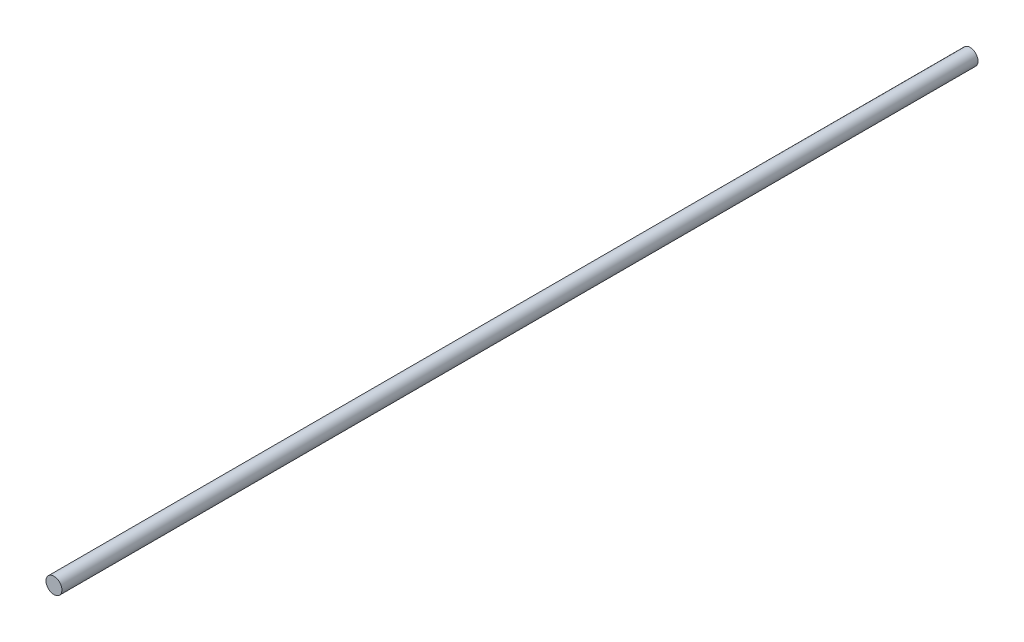
ISO-10303-21;
HEADER;
FILE_DESCRIPTION(('STEP AP214'),'2;1');
FILE_NAME('part.step','',(''),(''),'','','');
FILE_SCHEMA(('AUTOMOTIVE_DESIGN { 1 0 10303 214 1 1 1 1 }'));
ENDSEC;
DATA;
#1=APPLICATION_CONTEXT('core data for automotive mechanical design processes');
#2=APPLICATION_PROTOCOL_DEFINITION('international standard','automotive_design',2000,#1);
#3=PRODUCT_CONTEXT('',#1,'mechanical');
#4=PRODUCT('Part','Part','',(#3));
#5=PRODUCT_RELATED_PRODUCT_CATEGORY('part','',(#4));
#6=PRODUCT_DEFINITION_FORMATION('','',#4);
#7=PRODUCT_DEFINITION_CONTEXT('part definition',#1,'design');
#8=PRODUCT_DEFINITION('design','',#6,#7);
#9=PRODUCT_DEFINITION_SHAPE('','',#8);
#10=(LENGTH_UNIT() NAMED_UNIT(*) SI_UNIT(.MILLI.,.METRE.));
#11=(NAMED_UNIT(*) PLANE_ANGLE_UNIT() SI_UNIT($,.RADIAN.));
#12=(NAMED_UNIT(*) SI_UNIT($,.STERADIAN.) SOLID_ANGLE_UNIT());
#13=UNCERTAINTY_MEASURE_WITH_UNIT(LENGTH_MEASURE(1.E-05),#10,'distance_accuracy_value','');
#14=(GEOMETRIC_REPRESENTATION_CONTEXT(3) GLOBAL_UNCERTAINTY_ASSIGNED_CONTEXT((#13)) GLOBAL_UNIT_ASSIGNED_CONTEXT((#10,
#11,#12)) REPRESENTATION_CONTEXT('',''));
#15=CARTESIAN_POINT('',(0.,0.,0.));
#16=DIRECTION('',(0.,0.,1.));
#17=DIRECTION('',(1.,0.,0.));
#18=AXIS2_PLACEMENT_3D('',#15,#16,#17);
#19=CARTESIAN_POINT('',(0.,0.,460.));
#20=DIRECTION('',(0.,0.,-1.));
#21=DIRECTION('',(-1.,0.,0.));
#22=AXIS2_PLACEMENT_3D('',#19,#20,#21);
#23=CYLINDRICAL_SURFACE('',#22,4.);
#24=CARTESIAN_POINT('',(0.,0.,460.));
#25=DIRECTION('',(0.,0.,1.));
#26=DIRECTION('',(1.,0.,0.));
#27=AXIS2_PLACEMENT_3D('',#24,#25,#26);
#28=CIRCLE('',#27,4.);
#29=CARTESIAN_POINT('',(4.,0.,460.));
#30=VERTEX_POINT('',#29);
#31=EDGE_CURVE('E10',#30,#30,#28,.T.);
#32=ORIENTED_EDGE('',*,*,#31,.F.);
#33=EDGE_LOOP('',(#32));
#34=FACE_BOUND('',#33,.T.);
#35=CARTESIAN_POINT('',(0.,0.,0.));
#36=DIRECTION('',(0.,0.,1.));
#37=DIRECTION('',(1.,0.,0.));
#38=AXIS2_PLACEMENT_3D('',#35,#36,#37);
#39=CIRCLE('',#38,4.);
#40=CARTESIAN_POINT('',(4.,0.,0.));
#41=VERTEX_POINT('',#40);
#42=EDGE_CURVE('E46',#41,#41,#39,.T.);
#43=ORIENTED_EDGE('',*,*,#42,.T.);
#44=EDGE_LOOP('',(#43));
#45=FACE_BOUND('',#44,.T.);
#46=ADVANCED_FACE('F43',(#34,#45),#23,.T.);
#47=CARTESIAN_POINT('',(0.,0.,460.));
#48=DIRECTION('',(0.,0.,1.));
#49=DIRECTION('',(1.,0.,0.));
#50=AXIS2_PLACEMENT_3D('',#47,#48,#49);
#51=PLANE('',#50);
#52=ORIENTED_EDGE('',*,*,#31,.T.);
#53=EDGE_LOOP('',(#52));
#54=FACE_BOUND('',#53,.T.);
#55=ADVANCED_FACE('F60',(#54),#51,.T.);
#56=CARTESIAN_POINT('',(0.,0.,0.));
#57=DIRECTION('',(0.,0.,1.));
#58=DIRECTION('',(1.,0.,0.));
#59=AXIS2_PLACEMENT_3D('',#56,#57,#58);
#60=PLANE('',#59);
#61=ORIENTED_EDGE('',*,*,#42,.F.);
#62=EDGE_LOOP('',(#61));
#63=FACE_BOUND('',#62,.T.);
#64=ADVANCED_FACE('F58',(#63),#60,.F.);
#65=CLOSED_SHELL('',(#46,#55,#64));
#66=MANIFOLD_SOLID_BREP('B2',#65);
#67=ADVANCED_BREP_SHAPE_REPRESENTATION('',(#18,#66),#14);
#68=SHAPE_DEFINITION_REPRESENTATION(#9,#67);
ENDSEC;
END-ISO-10303-21;
